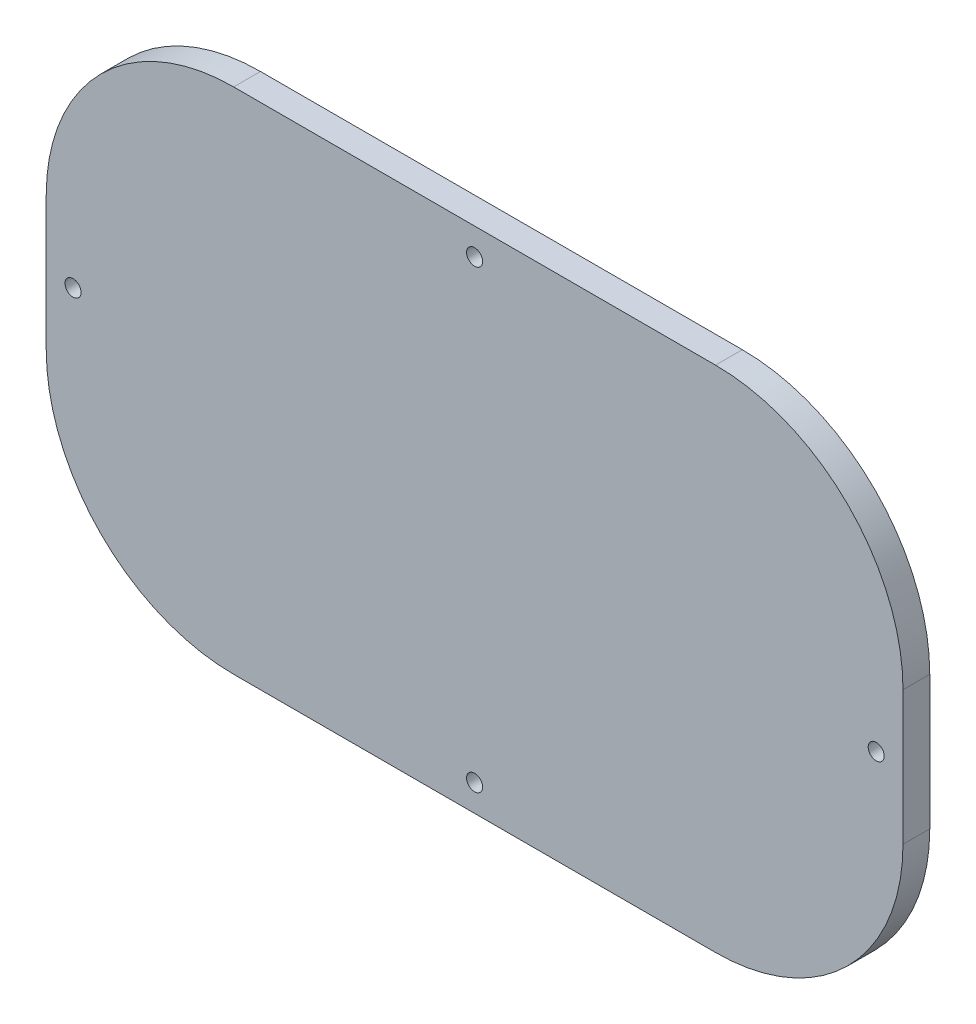
ISO-10303-21;
HEADER;
FILE_DESCRIPTION(('STEP AP214'),'2;1');
FILE_NAME('part.step','',(''),(''),'','','');
FILE_SCHEMA(('AUTOMOTIVE_DESIGN { 1 0 10303 214 1 1 1 1 }'));
ENDSEC;
DATA;
#1=APPLICATION_CONTEXT('core data for automotive mechanical design processes');
#2=APPLICATION_PROTOCOL_DEFINITION('international standard','automotive_design',2000,#1);
#3=PRODUCT_CONTEXT('',#1,'mechanical');
#4=PRODUCT('Part','Part','',(#3));
#5=PRODUCT_RELATED_PRODUCT_CATEGORY('part','',(#4));
#6=PRODUCT_DEFINITION_FORMATION('','',#4);
#7=PRODUCT_DEFINITION_CONTEXT('part definition',#1,'design');
#8=PRODUCT_DEFINITION('design','',#6,#7);
#9=PRODUCT_DEFINITION_SHAPE('','',#8);
#10=(LENGTH_UNIT() NAMED_UNIT(*) SI_UNIT(.MILLI.,.METRE.));
#11=(NAMED_UNIT(*) PLANE_ANGLE_UNIT() SI_UNIT($,.RADIAN.));
#12=(NAMED_UNIT(*) SI_UNIT($,.STERADIAN.) SOLID_ANGLE_UNIT());
#13=UNCERTAINTY_MEASURE_WITH_UNIT(LENGTH_MEASURE(1.E-05),#10,'distance_accuracy_value','');
#14=(GEOMETRIC_REPRESENTATION_CONTEXT(3) GLOBAL_UNCERTAINTY_ASSIGNED_CONTEXT((#13)) GLOBAL_UNIT_ASSIGNED_CONTEXT((#10,
#11,#12)) REPRESENTATION_CONTEXT('',''));
#15=CARTESIAN_POINT('',(0.,0.,0.));
#16=DIRECTION('',(0.,0.,1.));
#17=DIRECTION('',(1.,0.,0.));
#18=AXIS2_PLACEMENT_3D('',#15,#16,#17);
#19=CARTESIAN_POINT('',(46.1080439503028,12.0844835186365,5.));
#20=DIRECTION('',(0.,0.,1.));
#21=DIRECTION('',(1.,0.,0.));
#22=AXIS2_PLACEMENT_3D('',#19,#20,#21);
#23=PLANE('',#22);
#24=CARTESIAN_POINT('',(1.10804395030284,42.0844835186365,5.));
#25=DIRECTION('',(0.,0.,1.));
#26=DIRECTION('',(1.,0.,0.));
#27=AXIS2_PLACEMENT_3D('',#24,#25,#26);
#28=CIRCLE('',#27,1.5);
#29=CARTESIAN_POINT('',(2.60804395030284,42.0844835186365,5.));
#30=VERTEX_POINT('',#29);
#31=EDGE_CURVE('E189',#30,#30,#28,.T.);
#32=ORIENTED_EDGE('',*,*,#31,.F.);
#33=EDGE_LOOP('',(#32));
#34=FACE_BOUND('',#33,.T.);
#35=CARTESIAN_POINT('',(-73.8919560496972,-0.415516481363593,5.));
#36=DIRECTION('',(0.,0.,1.));
#37=DIRECTION('',(1.,0.,0.));
#38=AXIS2_PLACEMENT_3D('',#35,#36,#37);
#39=CIRCLE('',#38,1.5);
#40=CARTESIAN_POINT('',(-72.3919560496972,-0.415516481363593,5.));
#41=VERTEX_POINT('',#40);
#42=EDGE_CURVE('E135',#41,#41,#39,.T.);
#43=ORIENTED_EDGE('',*,*,#42,.F.);
#44=EDGE_LOOP('',(#43));
#45=FACE_BOUND('',#44,.T.);
#46=CARTESIAN_POINT('',(46.1080439503028,12.0844835186365,5.));
#47=DIRECTION('',(0.,0.,1.));
#48=DIRECTION('',(1.,0.,0.));
#49=AXIS2_PLACEMENT_3D('',#46,#47,#48);
#50=CIRCLE('',#49,35.);
#51=CARTESIAN_POINT('',(81.1080439503029,12.0844835186365,5.));
#52=VERTEX_POINT('',#51);
#53=CARTESIAN_POINT('',(46.1080439503028,47.0844835186365,5.));
#54=VERTEX_POINT('',#53);
#55=EDGE_CURVE('E146',#52,#54,#50,.T.);
#56=ORIENTED_EDGE('',*,*,#55,.T.);
#57=DIRECTION('',(-1.,0.,0.));
#58=VECTOR('',#57,1.);
#59=CARTESIAN_POINT('',(46.1080439503028,47.0844835186365,5.));
#60=LINE('',#59,#58);
#61=CARTESIAN_POINT('',(-43.8919560496972,47.0844835186364,5.));
#62=VERTEX_POINT('',#61);
#63=EDGE_CURVE('E94',#54,#62,#60,.T.);
#64=ORIENTED_EDGE('',*,*,#63,.T.);
#65=CARTESIAN_POINT('',(-43.8919560496972,12.0844835186364,5.));
#66=DIRECTION('',(0.,0.,1.));
#67=DIRECTION('',(1.,0.,0.));
#68=AXIS2_PLACEMENT_3D('',#65,#66,#67);
#69=CIRCLE('',#68,35.);
#70=CARTESIAN_POINT('',(-78.8919560496972,12.0844835186364,5.));
#71=VERTEX_POINT('',#70);
#72=EDGE_CURVE('E161',#62,#71,#69,.T.);
#73=ORIENTED_EDGE('',*,*,#72,.T.);
#74=DIRECTION('',(0.,-1.,0.));
#75=VECTOR('',#74,1.);
#76=CARTESIAN_POINT('',(-78.8919560496972,12.0844835186364,5.));
#77=LINE('',#76,#75);
#78=CARTESIAN_POINT('',(-78.8919560496972,-12.9155164813636,5.));
#79=VERTEX_POINT('',#78);
#80=EDGE_CURVE('E174',#71,#79,#77,.T.);
#81=ORIENTED_EDGE('',*,*,#80,.T.);
#82=CARTESIAN_POINT('',(-43.8919560496972,-12.9155164813636,5.));
#83=DIRECTION('',(0.,0.,1.));
#84=DIRECTION('',(1.,0.,0.));
#85=AXIS2_PLACEMENT_3D('',#82,#83,#84);
#86=CIRCLE('',#85,35.);
#87=CARTESIAN_POINT('',(-43.8919560496972,-47.9155164813636,5.));
#88=VERTEX_POINT('',#87);
#89=EDGE_CURVE('E113',#79,#88,#86,.T.);
#90=ORIENTED_EDGE('',*,*,#89,.T.);
#91=DIRECTION('',(1.,0.,0.));
#92=VECTOR('',#91,1.);
#93=CARTESIAN_POINT('',(-43.8919560496972,-47.9155164813636,5.));
#94=LINE('',#93,#92);
#95=CARTESIAN_POINT('',(46.1080439503028,-47.9155164813636,5.));
#96=VERTEX_POINT('',#95);
#97=EDGE_CURVE('E107',#88,#96,#94,.T.);
#98=ORIENTED_EDGE('',*,*,#97,.T.);
#99=CARTESIAN_POINT('',(46.1080439503028,-12.9155164813636,5.));
#100=DIRECTION('',(0.,0.,1.));
#101=DIRECTION('',(1.,0.,0.));
#102=AXIS2_PLACEMENT_3D('',#99,#100,#101);
#103=CIRCLE('',#102,35.);
#104=CARTESIAN_POINT('',(81.1080439503029,-12.9155164813636,5.));
#105=VERTEX_POINT('',#104);
#106=EDGE_CURVE('E111',#96,#105,#103,.T.);
#107=ORIENTED_EDGE('',*,*,#106,.T.);
#108=DIRECTION('',(0.,1.,0.));
#109=VECTOR('',#108,1.);
#110=CARTESIAN_POINT('',(81.1080439503029,-12.9155164813636,5.));
#111=LINE('',#110,#109);
#112=EDGE_CURVE('E51',#105,#52,#111,.T.);
#113=ORIENTED_EDGE('',*,*,#112,.T.);
#114=EDGE_LOOP('',(#56,#64,#73,#81,#90,#98,#107,#113));
#115=FACE_BOUND('',#114,.T.);
#116=CARTESIAN_POINT('',(76.1080439503028,-0.415516481363648,5.));
#117=DIRECTION('',(0.,0.,1.));
#118=DIRECTION('',(-1.,0.,0.));
#119=AXIS2_PLACEMENT_3D('',#116,#117,#118);
#120=CIRCLE('',#119,1.5);
#121=CARTESIAN_POINT('',(74.6080439503028,-0.415516481363648,5.));
#122=VERTEX_POINT('',#121);
#123=EDGE_CURVE('E183',#122,#122,#120,.T.);
#124=ORIENTED_EDGE('',*,*,#123,.F.);
#125=EDGE_LOOP('',(#124));
#126=FACE_BOUND('',#125,.T.);
#127=CARTESIAN_POINT('',(1.10804395030281,-42.9155164813636,5.));
#128=DIRECTION('',(0.,0.,1.));
#129=DIRECTION('',(1.,0.,0.));
#130=AXIS2_PLACEMENT_3D('',#127,#128,#129);
#131=CIRCLE('',#130,1.5);
#132=CARTESIAN_POINT('',(2.60804395030281,-42.9155164813636,5.));
#133=VERTEX_POINT('',#132);
#134=EDGE_CURVE('E195',#133,#133,#131,.T.);
#135=ORIENTED_EDGE('',*,*,#134,.F.);
#136=EDGE_LOOP('',(#135));
#137=FACE_BOUND('',#136,.T.);
#138=ADVANCED_FACE('F34',(#34,#45,#115,#126,#137),#23,.T.);
#139=CARTESIAN_POINT('',(46.1080439503028,12.0844835186365,0.));
#140=DIRECTION('',(0.,0.,1.));
#141=DIRECTION('',(1.,0.,0.));
#142=AXIS2_PLACEMENT_3D('',#139,#140,#141);
#143=PLANE('',#142);
#144=CARTESIAN_POINT('',(46.1080439503028,12.0844835186365,0.));
#145=DIRECTION('',(0.,0.,1.));
#146=DIRECTION('',(1.,0.,0.));
#147=AXIS2_PLACEMENT_3D('',#144,#145,#146);
#148=CIRCLE('',#147,35.);
#149=CARTESIAN_POINT('',(81.1080439503029,12.0844835186365,0.));
#150=VERTEX_POINT('',#149);
#151=CARTESIAN_POINT('',(46.1080439503028,47.0844835186365,0.));
#152=VERTEX_POINT('',#151);
#153=EDGE_CURVE('E131',#150,#152,#148,.T.);
#154=ORIENTED_EDGE('',*,*,#153,.F.);
#155=DIRECTION('',(0.,1.,0.));
#156=VECTOR('',#155,1.);
#157=CARTESIAN_POINT('',(81.1080439503029,-12.9155164813636,0.));
#158=LINE('',#157,#156);
#159=CARTESIAN_POINT('',(81.1080439503029,-12.9155164813636,0.));
#160=VERTEX_POINT('',#159);
#161=EDGE_CURVE('E86',#160,#150,#158,.T.);
#162=ORIENTED_EDGE('',*,*,#161,.F.);
#163=CARTESIAN_POINT('',(46.1080439503028,-12.9155164813636,0.));
#164=DIRECTION('',(0.,0.,1.));
#165=DIRECTION('',(1.,0.,0.));
#166=AXIS2_PLACEMENT_3D('',#163,#164,#165);
#167=CIRCLE('',#166,35.);
#168=CARTESIAN_POINT('',(46.1080439503028,-47.9155164813636,0.));
#169=VERTEX_POINT('',#168);
#170=EDGE_CURVE('E80',#169,#160,#167,.T.);
#171=ORIENTED_EDGE('',*,*,#170,.F.);
#172=DIRECTION('',(1.,0.,0.));
#173=VECTOR('',#172,1.);
#174=CARTESIAN_POINT('',(-43.8919560496972,-47.9155164813636,0.));
#175=LINE('',#174,#173);
#176=CARTESIAN_POINT('',(-43.8919560496972,-47.9155164813636,0.));
#177=VERTEX_POINT('',#176);
#178=EDGE_CURVE('E121',#177,#169,#175,.T.);
#179=ORIENTED_EDGE('',*,*,#178,.F.);
#180=CARTESIAN_POINT('',(-43.8919560496972,-12.9155164813636,0.));
#181=DIRECTION('',(0.,0.,1.));
#182=DIRECTION('',(1.,0.,0.));
#183=AXIS2_PLACEMENT_3D('',#180,#181,#182);
#184=CIRCLE('',#183,35.);
#185=CARTESIAN_POINT('',(-78.8919560496972,-12.9155164813636,0.));
#186=VERTEX_POINT('',#185);
#187=EDGE_CURVE('E141',#186,#177,#184,.T.);
#188=ORIENTED_EDGE('',*,*,#187,.F.);
#189=DIRECTION('',(0.,-1.,0.));
#190=VECTOR('',#189,1.);
#191=CARTESIAN_POINT('',(-78.8919560496972,12.0844835186364,0.));
#192=LINE('',#191,#190);
#193=CARTESIAN_POINT('',(-78.8919560496972,12.0844835186364,0.));
#194=VERTEX_POINT('',#193);
#195=EDGE_CURVE('E139',#194,#186,#192,.T.);
#196=ORIENTED_EDGE('',*,*,#195,.F.);
#197=CARTESIAN_POINT('',(-43.8919560496972,12.0844835186364,0.));
#198=DIRECTION('',(0.,0.,1.));
#199=DIRECTION('',(1.,0.,0.));
#200=AXIS2_PLACEMENT_3D('',#197,#198,#199);
#201=CIRCLE('',#200,35.);
#202=CARTESIAN_POINT('',(-43.8919560496972,47.0844835186364,0.));
#203=VERTEX_POINT('',#202);
#204=EDGE_CURVE('E137',#203,#194,#201,.T.);
#205=ORIENTED_EDGE('',*,*,#204,.F.);
#206=DIRECTION('',(-1.,0.,0.));
#207=VECTOR('',#206,1.);
#208=CARTESIAN_POINT('',(46.1080439503028,47.0844835186365,0.));
#209=LINE('',#208,#207);
#210=EDGE_CURVE('E134',#152,#203,#209,.T.);
#211=ORIENTED_EDGE('',*,*,#210,.F.);
#212=EDGE_LOOP('',(#154,#162,#171,#179,#188,#196,#205,#211));
#213=FACE_BOUND('',#212,.T.);
#214=CARTESIAN_POINT('',(-73.8919560496972,-0.415516481363593,0.));
#215=DIRECTION('',(0.,0.,1.));
#216=DIRECTION('',(1.,0.,0.));
#217=AXIS2_PLACEMENT_3D('',#214,#215,#216);
#218=CIRCLE('',#217,1.5);
#219=CARTESIAN_POINT('',(-72.3919560496972,-0.415516481363593,0.));
#220=VERTEX_POINT('',#219);
#221=EDGE_CURVE('E180',#220,#220,#218,.T.);
#222=ORIENTED_EDGE('',*,*,#221,.T.);
#223=EDGE_LOOP('',(#222));
#224=FACE_BOUND('',#223,.T.);
#225=CARTESIAN_POINT('',(76.1080439503028,-0.415516481363648,0.));
#226=DIRECTION('',(0.,0.,1.));
#227=DIRECTION('',(-1.,0.,0.));
#228=AXIS2_PLACEMENT_3D('',#225,#226,#227);
#229=CIRCLE('',#228,1.5);
#230=CARTESIAN_POINT('',(74.6080439503028,-0.415516481363648,0.));
#231=VERTEX_POINT('',#230);
#232=EDGE_CURVE('E186',#231,#231,#229,.T.);
#233=ORIENTED_EDGE('',*,*,#232,.T.);
#234=EDGE_LOOP('',(#233));
#235=FACE_BOUND('',#234,.T.);
#236=CARTESIAN_POINT('',(1.10804395030284,42.0844835186365,0.));
#237=DIRECTION('',(0.,0.,1.));
#238=DIRECTION('',(1.,0.,0.));
#239=AXIS2_PLACEMENT_3D('',#236,#237,#238);
#240=CIRCLE('',#239,1.5);
#241=CARTESIAN_POINT('',(2.60804395030284,42.0844835186365,0.));
#242=VERTEX_POINT('',#241);
#243=EDGE_CURVE('E192',#242,#242,#240,.T.);
#244=ORIENTED_EDGE('',*,*,#243,.T.);
#245=EDGE_LOOP('',(#244));
#246=FACE_BOUND('',#245,.T.);
#247=CARTESIAN_POINT('',(1.10804395030281,-42.9155164813636,0.));
#248=DIRECTION('',(0.,0.,1.));
#249=DIRECTION('',(1.,0.,0.));
#250=AXIS2_PLACEMENT_3D('',#247,#248,#249);
#251=CIRCLE('',#250,1.5);
#252=CARTESIAN_POINT('',(2.60804395030281,-42.9155164813636,0.));
#253=VERTEX_POINT('',#252);
#254=EDGE_CURVE('E198',#253,#253,#251,.T.);
#255=ORIENTED_EDGE('',*,*,#254,.T.);
#256=EDGE_LOOP('',(#255));
#257=FACE_BOUND('',#256,.T.);
#258=ADVANCED_FACE('F165',(#213,#224,#235,#246,#257),#143,.F.);
#259=CARTESIAN_POINT('',(46.1080439503028,12.0844835186365,5.));
#260=DIRECTION('',(0.,0.,-1.));
#261=DIRECTION('',(-1.,0.,0.));
#262=AXIS2_PLACEMENT_3D('',#259,#260,#261);
#263=CYLINDRICAL_SURFACE('',#262,35.);
#264=ORIENTED_EDGE('',*,*,#153,.T.);
#265=DIRECTION('',(0.,0.,-1.));
#266=VECTOR('',#265,1.);
#267=CARTESIAN_POINT('',(46.1080439503028,47.0844835186365,5.));
#268=LINE('',#267,#266);
#269=EDGE_CURVE('E11',#54,#152,#268,.T.);
#270=ORIENTED_EDGE('',*,*,#269,.F.);
#271=ORIENTED_EDGE('',*,*,#55,.F.);
#272=DIRECTION('',(0.,0.,-1.));
#273=VECTOR('',#272,1.);
#274=CARTESIAN_POINT('',(81.1080439503029,12.0844835186365,5.));
#275=LINE('',#274,#273);
#276=EDGE_CURVE('E127',#52,#150,#275,.T.);
#277=ORIENTED_EDGE('',*,*,#276,.T.);
#278=EDGE_LOOP('',(#264,#270,#271,#277));
#279=FACE_BOUND('',#278,.T.);
#280=ADVANCED_FACE('F36',(#279),#263,.T.);
#281=CARTESIAN_POINT('',(46.1080439503028,47.0844835186365,5.));
#282=DIRECTION('',(0.,-1.,0.));
#283=DIRECTION('',(1.,0.,0.));
#284=AXIS2_PLACEMENT_3D('',#281,#282,#283);
#285=PLANE('',#284);
#286=ORIENTED_EDGE('',*,*,#210,.T.);
#287=DIRECTION('',(0.,0.,-1.));
#288=VECTOR('',#287,1.);
#289=CARTESIAN_POINT('',(-43.8919560496972,47.0844835186364,5.));
#290=LINE('',#289,#288);
#291=EDGE_CURVE('E43',#62,#203,#290,.T.);
#292=ORIENTED_EDGE('',*,*,#291,.F.);
#293=ORIENTED_EDGE('',*,*,#63,.F.);
#294=ORIENTED_EDGE('',*,*,#269,.T.);
#295=EDGE_LOOP('',(#286,#292,#293,#294));
#296=FACE_BOUND('',#295,.T.);
#297=ADVANCED_FACE('F232',(#296),#285,.F.);
#298=CARTESIAN_POINT('',(-43.8919560496972,12.0844835186364,5.));
#299=DIRECTION('',(0.,0.,-1.));
#300=DIRECTION('',(-1.,0.,0.));
#301=AXIS2_PLACEMENT_3D('',#298,#299,#300);
#302=CYLINDRICAL_SURFACE('',#301,35.);
#303=ORIENTED_EDGE('',*,*,#204,.T.);
#304=DIRECTION('',(0.,0.,-1.));
#305=VECTOR('',#304,1.);
#306=CARTESIAN_POINT('',(-78.8919560496972,12.0844835186364,5.));
#307=LINE('',#306,#305);
#308=EDGE_CURVE('E153',#71,#194,#307,.T.);
#309=ORIENTED_EDGE('',*,*,#308,.F.);
#310=ORIENTED_EDGE('',*,*,#72,.F.);
#311=ORIENTED_EDGE('',*,*,#291,.T.);
#312=EDGE_LOOP('',(#303,#309,#310,#311));
#313=FACE_BOUND('',#312,.T.);
#314=ADVANCED_FACE('F159',(#313),#302,.T.);
#315=CARTESIAN_POINT('',(-78.8919560496972,12.0844835186364,5.));
#316=DIRECTION('',(1.,0.,0.));
#317=DIRECTION('',(0.,0.,-1.));
#318=AXIS2_PLACEMENT_3D('',#315,#316,#317);
#319=PLANE('',#318);
#320=ORIENTED_EDGE('',*,*,#195,.T.);
#321=DIRECTION('',(0.,0.,-1.));
#322=VECTOR('',#321,1.);
#323=CARTESIAN_POINT('',(-78.8919560496972,-12.9155164813636,5.));
#324=LINE('',#323,#322);
#325=EDGE_CURVE('E150',#79,#186,#324,.T.);
#326=ORIENTED_EDGE('',*,*,#325,.F.);
#327=ORIENTED_EDGE('',*,*,#80,.F.);
#328=ORIENTED_EDGE('',*,*,#308,.T.);
#329=EDGE_LOOP('',(#320,#326,#327,#328));
#330=FACE_BOUND('',#329,.T.);
#331=ADVANCED_FACE('F170',(#330),#319,.F.);
#332=CARTESIAN_POINT('',(-43.8919560496972,-12.9155164813636,5.));
#333=DIRECTION('',(0.,0.,-1.));
#334=DIRECTION('',(-1.,0.,0.));
#335=AXIS2_PLACEMENT_3D('',#332,#333,#334);
#336=CYLINDRICAL_SURFACE('',#335,35.);
#337=ORIENTED_EDGE('',*,*,#187,.T.);
#338=DIRECTION('',(0.,0.,-1.));
#339=VECTOR('',#338,1.);
#340=CARTESIAN_POINT('',(-43.8919560496972,-47.9155164813636,5.));
#341=LINE('',#340,#339);
#342=EDGE_CURVE('E122',#88,#177,#341,.T.);
#343=ORIENTED_EDGE('',*,*,#342,.F.);
#344=ORIENTED_EDGE('',*,*,#89,.F.);
#345=ORIENTED_EDGE('',*,*,#325,.T.);
#346=EDGE_LOOP('',(#337,#343,#344,#345));
#347=FACE_BOUND('',#346,.T.);
#348=ADVANCED_FACE('F173',(#347),#336,.T.);
#349=CARTESIAN_POINT('',(-43.8919560496972,-47.9155164813636,5.));
#350=DIRECTION('',(0.,1.,0.));
#351=DIRECTION('',(0.,0.,1.));
#352=AXIS2_PLACEMENT_3D('',#349,#350,#351);
#353=PLANE('',#352);
#354=ORIENTED_EDGE('',*,*,#178,.T.);
#355=DIRECTION('',(0.,0.,-1.));
#356=VECTOR('',#355,1.);
#357=CARTESIAN_POINT('',(46.1080439503028,-47.9155164813636,5.));
#358=LINE('',#357,#356);
#359=EDGE_CURVE('E118',#96,#169,#358,.T.);
#360=ORIENTED_EDGE('',*,*,#359,.F.);
#361=ORIENTED_EDGE('',*,*,#97,.F.);
#362=ORIENTED_EDGE('',*,*,#342,.T.);
#363=EDGE_LOOP('',(#354,#360,#361,#362));
#364=FACE_BOUND('',#363,.T.);
#365=ADVANCED_FACE('F119',(#364),#353,.F.);
#366=CARTESIAN_POINT('',(46.1080439503028,-12.9155164813636,5.));
#367=DIRECTION('',(0.,0.,-1.));
#368=DIRECTION('',(-1.,0.,0.));
#369=AXIS2_PLACEMENT_3D('',#366,#367,#368);
#370=CYLINDRICAL_SURFACE('',#369,35.);
#371=ORIENTED_EDGE('',*,*,#170,.T.);
#372=DIRECTION('',(0.,0.,-1.));
#373=VECTOR('',#372,1.);
#374=CARTESIAN_POINT('',(81.1080439503029,-12.9155164813636,5.));
#375=LINE('',#374,#373);
#376=EDGE_CURVE('E123',#105,#160,#375,.T.);
#377=ORIENTED_EDGE('',*,*,#376,.F.);
#378=ORIENTED_EDGE('',*,*,#106,.F.);
#379=ORIENTED_EDGE('',*,*,#359,.T.);
#380=EDGE_LOOP('',(#371,#377,#378,#379));
#381=FACE_BOUND('',#380,.T.);
#382=ADVANCED_FACE('F125',(#381),#370,.T.);
#383=CARTESIAN_POINT('',(81.1080439503029,-12.9155164813636,5.));
#384=DIRECTION('',(-1.,0.,0.));
#385=DIRECTION('',(0.,0.,1.));
#386=AXIS2_PLACEMENT_3D('',#383,#384,#385);
#387=PLANE('',#386);
#388=ORIENTED_EDGE('',*,*,#161,.T.);
#389=ORIENTED_EDGE('',*,*,#276,.F.);
#390=ORIENTED_EDGE('',*,*,#112,.F.);
#391=ORIENTED_EDGE('',*,*,#376,.T.);
#392=EDGE_LOOP('',(#388,#389,#390,#391));
#393=FACE_BOUND('',#392,.T.);
#394=ADVANCED_FACE('F220',(#393),#387,.F.);
#395=CARTESIAN_POINT('',(-73.8919560496972,-0.415516481363593,5.));
#396=DIRECTION('',(0.,0.,-1.));
#397=DIRECTION('',(-1.,0.,0.));
#398=AXIS2_PLACEMENT_3D('',#395,#396,#397);
#399=CYLINDRICAL_SURFACE('',#398,1.5);
#400=ORIENTED_EDGE('',*,*,#42,.T.);
#401=EDGE_LOOP('',(#400));
#402=FACE_BOUND('',#401,.T.);
#403=ORIENTED_EDGE('',*,*,#221,.F.);
#404=EDGE_LOOP('',(#403));
#405=FACE_BOUND('',#404,.T.);
#406=ADVANCED_FACE('F217',(#402,#405),#399,.F.);
#407=CARTESIAN_POINT('',(76.1080439503028,-0.415516481363648,5.));
#408=DIRECTION('',(0.,0.,-1.));
#409=DIRECTION('',(-1.,0.,0.));
#410=AXIS2_PLACEMENT_3D('',#407,#408,#409);
#411=CYLINDRICAL_SURFACE('',#410,1.5);
#412=ORIENTED_EDGE('',*,*,#123,.T.);
#413=EDGE_LOOP('',(#412));
#414=FACE_BOUND('',#413,.T.);
#415=ORIENTED_EDGE('',*,*,#232,.F.);
#416=EDGE_LOOP('',(#415));
#417=FACE_BOUND('',#416,.T.);
#418=ADVANCED_FACE('F296',(#414,#417),#411,.F.);
#419=CARTESIAN_POINT('',(1.10804395030284,42.0844835186365,5.));
#420=DIRECTION('',(0.,0.,-1.));
#421=DIRECTION('',(-1.,0.,0.));
#422=AXIS2_PLACEMENT_3D('',#419,#420,#421);
#423=CYLINDRICAL_SURFACE('',#422,1.5);
#424=ORIENTED_EDGE('',*,*,#31,.T.);
#425=EDGE_LOOP('',(#424));
#426=FACE_BOUND('',#425,.T.);
#427=ORIENTED_EDGE('',*,*,#243,.F.);
#428=EDGE_LOOP('',(#427));
#429=FACE_BOUND('',#428,.T.);
#430=ADVANCED_FACE('F304',(#426,#429),#423,.F.);
#431=CARTESIAN_POINT('',(1.10804395030281,-42.9155164813636,5.));
#432=DIRECTION('',(0.,0.,-1.));
#433=DIRECTION('',(-1.,0.,0.));
#434=AXIS2_PLACEMENT_3D('',#431,#432,#433);
#435=CYLINDRICAL_SURFACE('',#434,1.5);
#436=ORIENTED_EDGE('',*,*,#134,.T.);
#437=EDGE_LOOP('',(#436));
#438=FACE_BOUND('',#437,.T.);
#439=ORIENTED_EDGE('',*,*,#254,.F.);
#440=EDGE_LOOP('',(#439));
#441=FACE_BOUND('',#440,.T.);
#442=ADVANCED_FACE('F204',(#438,#441),#435,.F.);
#443=CLOSED_SHELL('',(#138,#258,#280,#297,#314,#331,#348,#365,#382,#394,#406,#418,#430,#442));
#444=MANIFOLD_SOLID_BREP('B2',#443);
#445=ADVANCED_BREP_SHAPE_REPRESENTATION('',(#18,#444),#14);
#446=SHAPE_DEFINITION_REPRESENTATION(#9,#445);
ENDSEC;
END-ISO-10303-21;
